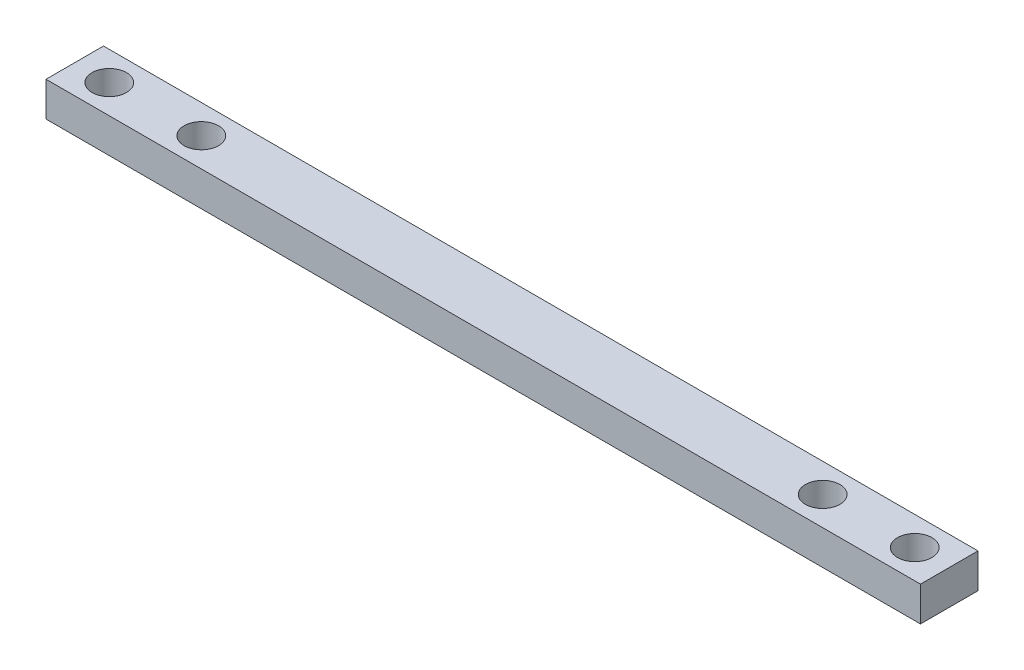
ISO-10303-21;
HEADER;
FILE_DESCRIPTION(('STEP AP214'),'2;1');
FILE_NAME('part.step','',(''),(''),'','','');
FILE_SCHEMA(('AUTOMOTIVE_DESIGN { 1 0 10303 214 1 1 1 1 }'));
ENDSEC;
DATA;
#1=APPLICATION_CONTEXT('core data for automotive mechanical design processes');
#2=APPLICATION_PROTOCOL_DEFINITION('international standard','automotive_design',2000,#1);
#3=PRODUCT_CONTEXT('',#1,'mechanical');
#4=PRODUCT('Part','Part','',(#3));
#5=PRODUCT_RELATED_PRODUCT_CATEGORY('part','',(#4));
#6=PRODUCT_DEFINITION_FORMATION('','',#4);
#7=PRODUCT_DEFINITION_CONTEXT('part definition',#1,'design');
#8=PRODUCT_DEFINITION('design','',#6,#7);
#9=PRODUCT_DEFINITION_SHAPE('','',#8);
#10=(LENGTH_UNIT() NAMED_UNIT(*) SI_UNIT(.MILLI.,.METRE.));
#11=(NAMED_UNIT(*) PLANE_ANGLE_UNIT() SI_UNIT($,.RADIAN.));
#12=(NAMED_UNIT(*) SI_UNIT($,.STERADIAN.) SOLID_ANGLE_UNIT());
#13=UNCERTAINTY_MEASURE_WITH_UNIT(LENGTH_MEASURE(1.E-05),#10,'distance_accuracy_value','');
#14=(GEOMETRIC_REPRESENTATION_CONTEXT(3) GLOBAL_UNCERTAINTY_ASSIGNED_CONTEXT((#13)) GLOBAL_UNIT_ASSIGNED_CONTEXT((#10,
#11,#12)) REPRESENTATION_CONTEXT('',''));
#15=CARTESIAN_POINT('',(0.,0.,0.));
#16=DIRECTION('',(0.,0.,1.));
#17=DIRECTION('',(1.,0.,0.));
#18=AXIS2_PLACEMENT_3D('',#15,#16,#17);
#19=CARTESIAN_POINT('',(0.,3.,0.));
#20=DIRECTION('',(0.,-1.,0.));
#21=DIRECTION('',(0.,0.,-1.));
#22=AXIS2_PLACEMENT_3D('',#19,#20,#21);
#23=PLANE('',#22);
#24=DIRECTION('',(0.,0.,-1.));
#25=VECTOR('',#24,1.);
#26=CARTESIAN_POINT('',(38.,3.,2.49999999999999));
#27=LINE('',#26,#25);
#28=CARTESIAN_POINT('',(38.,3.,2.49999999999999));
#29=VERTEX_POINT('',#28);
#30=CARTESIAN_POINT('',(38.,3.,-2.49999999999999));
#31=VERTEX_POINT('',#30);
#32=EDGE_CURVE('E85',#29,#31,#27,.T.);
#33=ORIENTED_EDGE('',*,*,#32,.T.);
#34=DIRECTION('',(-1.,0.,0.));
#35=VECTOR('',#34,1.);
#36=CARTESIAN_POINT('',(-38.,3.,-2.49999999999998));
#37=LINE('',#36,#35);
#38=CARTESIAN_POINT('',(-38.,3.,-2.49999999999998));
#39=VERTEX_POINT('',#38);
#40=EDGE_CURVE('E80',#31,#39,#37,.T.);
#41=ORIENTED_EDGE('',*,*,#40,.T.);
#42=DIRECTION('',(0.,0.,1.));
#43=VECTOR('',#42,1.);
#44=CARTESIAN_POINT('',(-38.,3.,2.5));
#45=LINE('',#44,#43);
#46=CARTESIAN_POINT('',(-38.,3.,2.5));
#47=VERTEX_POINT('',#46);
#48=EDGE_CURVE('E83',#39,#47,#45,.T.);
#49=ORIENTED_EDGE('',*,*,#48,.T.);
#50=DIRECTION('',(1.,0.,0.));
#51=VECTOR('',#50,1.);
#52=CARTESIAN_POINT('',(-38.,3.,2.5));
#53=LINE('',#52,#51);
#54=EDGE_CURVE('E50',#47,#29,#53,.T.);
#55=ORIENTED_EDGE('',*,*,#54,.T.);
#56=EDGE_LOOP('',(#33,#41,#49,#55));
#57=FACE_BOUND('',#56,.T.);
#58=CARTESIAN_POINT('',(-35.,3.,0.));
#59=DIRECTION('',(0.,1.,0.));
#60=DIRECTION('',(0.,0.,1.));
#61=AXIS2_PLACEMENT_3D('',#58,#59,#60);
#62=CIRCLE('',#61,1.5);
#63=CARTESIAN_POINT('',(-35.,3.,1.5));
#64=VERTEX_POINT('',#63);
#65=EDGE_CURVE('E100',#64,#64,#62,.T.);
#66=ORIENTED_EDGE('',*,*,#65,.F.);
#67=EDGE_LOOP('',(#66));
#68=FACE_BOUND('',#67,.T.);
#69=CARTESIAN_POINT('',(-27.,3.,0.));
#70=DIRECTION('',(0.,1.,0.));
#71=DIRECTION('',(0.,0.,1.));
#72=AXIS2_PLACEMENT_3D('',#69,#70,#71);
#73=CIRCLE('',#72,1.5);
#74=CARTESIAN_POINT('',(-27.,3.,1.5));
#75=VERTEX_POINT('',#74);
#76=EDGE_CURVE('E115',#75,#75,#73,.T.);
#77=ORIENTED_EDGE('',*,*,#76,.F.);
#78=EDGE_LOOP('',(#77));
#79=FACE_BOUND('',#78,.T.);
#80=CARTESIAN_POINT('',(35.,3.,0.));
#81=DIRECTION('',(0.,1.,0.));
#82=DIRECTION('',(0.,0.,-1.));
#83=AXIS2_PLACEMENT_3D('',#80,#81,#82);
#84=CIRCLE('',#83,1.5);
#85=CARTESIAN_POINT('',(35.,3.,-1.5));
#86=VERTEX_POINT('',#85);
#87=EDGE_CURVE('E121',#86,#86,#84,.T.);
#88=ORIENTED_EDGE('',*,*,#87,.F.);
#89=EDGE_LOOP('',(#88));
#90=FACE_BOUND('',#89,.T.);
#91=CARTESIAN_POINT('',(27.,3.,0.));
#92=DIRECTION('',(0.,1.,0.));
#93=DIRECTION('',(0.,0.,-1.));
#94=AXIS2_PLACEMENT_3D('',#91,#92,#93);
#95=CIRCLE('',#94,1.5);
#96=CARTESIAN_POINT('',(27.,3.,-1.5));
#97=VERTEX_POINT('',#96);
#98=EDGE_CURVE('E127',#97,#97,#95,.T.);
#99=ORIENTED_EDGE('',*,*,#98,.F.);
#100=EDGE_LOOP('',(#99));
#101=FACE_BOUND('',#100,.T.);
#102=ADVANCED_FACE('F33',(#57,#68,#79,#90,#101),#23,.F.);
#103=CARTESIAN_POINT('',(0.,0.,0.));
#104=DIRECTION('',(0.,-1.,0.));
#105=DIRECTION('',(0.,0.,-1.));
#106=AXIS2_PLACEMENT_3D('',#103,#104,#105);
#107=PLANE('',#106);
#108=CARTESIAN_POINT('',(35.,0.,0.));
#109=DIRECTION('',(0.,1.,0.));
#110=DIRECTION('',(0.,0.,-1.));
#111=AXIS2_PLACEMENT_3D('',#108,#109,#110);
#112=CIRCLE('',#111,1.5);
#113=CARTESIAN_POINT('',(35.,0.,-1.5));
#114=VERTEX_POINT('',#113);
#115=EDGE_CURVE('E124',#114,#114,#112,.T.);
#116=ORIENTED_EDGE('',*,*,#115,.T.);
#117=EDGE_LOOP('',(#116));
#118=FACE_BOUND('',#117,.T.);
#119=CARTESIAN_POINT('',(-35.,0.,0.));
#120=DIRECTION('',(0.,1.,0.));
#121=DIRECTION('',(0.,0.,1.));
#122=AXIS2_PLACEMENT_3D('',#119,#120,#121);
#123=CIRCLE('',#122,1.5);
#124=CARTESIAN_POINT('',(-35.,0.,1.5));
#125=VERTEX_POINT('',#124);
#126=EDGE_CURVE('E112',#125,#125,#123,.T.);
#127=ORIENTED_EDGE('',*,*,#126,.T.);
#128=EDGE_LOOP('',(#127));
#129=FACE_BOUND('',#128,.T.);
#130=DIRECTION('',(0.,0.,-1.));
#131=VECTOR('',#130,1.);
#132=CARTESIAN_POINT('',(38.,0.,2.49999999999999));
#133=LINE('',#132,#131);
#134=CARTESIAN_POINT('',(38.,0.,2.49999999999999));
#135=VERTEX_POINT('',#134);
#136=CARTESIAN_POINT('',(38.,0.,-2.49999999999999));
#137=VERTEX_POINT('',#136);
#138=EDGE_CURVE('E97',#135,#137,#133,.T.);
#139=ORIENTED_EDGE('',*,*,#138,.F.);
#140=DIRECTION('',(1.,0.,0.));
#141=VECTOR('',#140,1.);
#142=CARTESIAN_POINT('',(-38.,0.,2.5));
#143=LINE('',#142,#141);
#144=CARTESIAN_POINT('',(-38.,0.,2.5));
#145=VERTEX_POINT('',#144);
#146=EDGE_CURVE('E73',#145,#135,#143,.T.);
#147=ORIENTED_EDGE('',*,*,#146,.F.);
#148=DIRECTION('',(0.,0.,1.));
#149=VECTOR('',#148,1.);
#150=CARTESIAN_POINT('',(-38.,0.,2.5));
#151=LINE('',#150,#149);
#152=CARTESIAN_POINT('',(-38.,0.,-2.49999999999998));
#153=VERTEX_POINT('',#152);
#154=EDGE_CURVE('E67',#153,#145,#151,.T.);
#155=ORIENTED_EDGE('',*,*,#154,.F.);
#156=DIRECTION('',(-1.,0.,0.));
#157=VECTOR('',#156,1.);
#158=CARTESIAN_POINT('',(-38.,0.,-2.49999999999998));
#159=LINE('',#158,#157);
#160=EDGE_CURVE('E89',#137,#153,#159,.T.);
#161=ORIENTED_EDGE('',*,*,#160,.F.);
#162=EDGE_LOOP('',(#139,#147,#155,#161));
#163=FACE_BOUND('',#162,.T.);
#164=CARTESIAN_POINT('',(-27.,0.,0.));
#165=DIRECTION('',(0.,1.,0.));
#166=DIRECTION('',(0.,0.,1.));
#167=AXIS2_PLACEMENT_3D('',#164,#165,#166);
#168=CIRCLE('',#167,1.5);
#169=CARTESIAN_POINT('',(-27.,0.,1.5));
#170=VERTEX_POINT('',#169);
#171=EDGE_CURVE('E118',#170,#170,#168,.T.);
#172=ORIENTED_EDGE('',*,*,#171,.T.);
#173=EDGE_LOOP('',(#172));
#174=FACE_BOUND('',#173,.T.);
#175=CARTESIAN_POINT('',(27.,0.,0.));
#176=DIRECTION('',(0.,1.,0.));
#177=DIRECTION('',(0.,0.,-1.));
#178=AXIS2_PLACEMENT_3D('',#175,#176,#177);
#179=CIRCLE('',#178,1.5);
#180=CARTESIAN_POINT('',(27.,0.,-1.5));
#181=VERTEX_POINT('',#180);
#182=EDGE_CURVE('E130',#181,#181,#179,.T.);
#183=ORIENTED_EDGE('',*,*,#182,.T.);
#184=EDGE_LOOP('',(#183));
#185=FACE_BOUND('',#184,.T.);
#186=ADVANCED_FACE('F108',(#118,#129,#163,#174,#185),#107,.T.);
#187=CARTESIAN_POINT('',(38.,3.,2.49999999999999));
#188=DIRECTION('',(-1.,0.,0.));
#189=DIRECTION('',(0.,0.,1.));
#190=AXIS2_PLACEMENT_3D('',#187,#188,#189);
#191=PLANE('',#190);
#192=ORIENTED_EDGE('',*,*,#138,.T.);
#193=DIRECTION('',(0.,-1.,0.));
#194=VECTOR('',#193,1.);
#195=CARTESIAN_POINT('',(38.,3.,-2.49999999999999));
#196=LINE('',#195,#194);
#197=EDGE_CURVE('E11',#31,#137,#196,.T.);
#198=ORIENTED_EDGE('',*,*,#197,.F.);
#199=ORIENTED_EDGE('',*,*,#32,.F.);
#200=DIRECTION('',(0.,-1.,0.));
#201=VECTOR('',#200,1.);
#202=CARTESIAN_POINT('',(38.,3.,2.49999999999999));
#203=LINE('',#202,#201);
#204=EDGE_CURVE('E93',#29,#135,#203,.T.);
#205=ORIENTED_EDGE('',*,*,#204,.T.);
#206=EDGE_LOOP('',(#192,#198,#199,#205));
#207=FACE_BOUND('',#206,.T.);
#208=ADVANCED_FACE('F35',(#207),#191,.F.);
#209=CARTESIAN_POINT('',(-38.,3.,-2.49999999999998));
#210=DIRECTION('',(0.,0.,1.));
#211=DIRECTION('',(1.,0.,0.));
#212=AXIS2_PLACEMENT_3D('',#209,#210,#211);
#213=PLANE('',#212);
#214=ORIENTED_EDGE('',*,*,#160,.T.);
#215=DIRECTION('',(0.,-1.,0.));
#216=VECTOR('',#215,1.);
#217=CARTESIAN_POINT('',(-38.,3.,-2.49999999999998));
#218=LINE('',#217,#216);
#219=EDGE_CURVE('E42',#39,#153,#218,.T.);
#220=ORIENTED_EDGE('',*,*,#219,.F.);
#221=ORIENTED_EDGE('',*,*,#40,.F.);
#222=ORIENTED_EDGE('',*,*,#197,.T.);
#223=EDGE_LOOP('',(#214,#220,#221,#222));
#224=FACE_BOUND('',#223,.T.);
#225=ADVANCED_FACE('F88',(#224),#213,.F.);
#226=CARTESIAN_POINT('',(-38.,3.,2.5));
#227=DIRECTION('',(1.,0.,0.));
#228=DIRECTION('',(0.,0.,-1.));
#229=AXIS2_PLACEMENT_3D('',#226,#227,#228);
#230=PLANE('',#229);
#231=ORIENTED_EDGE('',*,*,#154,.T.);
#232=DIRECTION('',(0.,-1.,0.));
#233=VECTOR('',#232,1.);
#234=CARTESIAN_POINT('',(-38.,3.,2.5));
#235=LINE('',#234,#233);
#236=EDGE_CURVE('E90',#47,#145,#235,.T.);
#237=ORIENTED_EDGE('',*,*,#236,.F.);
#238=ORIENTED_EDGE('',*,*,#48,.F.);
#239=ORIENTED_EDGE('',*,*,#219,.T.);
#240=EDGE_LOOP('',(#231,#237,#238,#239));
#241=FACE_BOUND('',#240,.T.);
#242=ADVANCED_FACE('F91',(#241),#230,.F.);
#243=CARTESIAN_POINT('',(-38.,3.,2.5));
#244=DIRECTION('',(0.,0.,-1.));
#245=DIRECTION('',(-1.,0.,0.));
#246=AXIS2_PLACEMENT_3D('',#243,#244,#245);
#247=PLANE('',#246);
#248=ORIENTED_EDGE('',*,*,#146,.T.);
#249=ORIENTED_EDGE('',*,*,#204,.F.);
#250=ORIENTED_EDGE('',*,*,#54,.F.);
#251=ORIENTED_EDGE('',*,*,#236,.T.);
#252=EDGE_LOOP('',(#248,#249,#250,#251));
#253=FACE_BOUND('',#252,.T.);
#254=ADVANCED_FACE('F105',(#253),#247,.F.);
#255=CARTESIAN_POINT('',(-35.,3.,0.));
#256=DIRECTION('',(0.,-1.,0.));
#257=DIRECTION('',(0.,0.,-1.));
#258=AXIS2_PLACEMENT_3D('',#255,#256,#257);
#259=CYLINDRICAL_SURFACE('',#258,1.5);
#260=ORIENTED_EDGE('',*,*,#65,.T.);
#261=EDGE_LOOP('',(#260));
#262=FACE_BOUND('',#261,.T.);
#263=ORIENTED_EDGE('',*,*,#126,.F.);
#264=EDGE_LOOP('',(#263));
#265=FACE_BOUND('',#264,.T.);
#266=ADVANCED_FACE('F147',(#262,#265),#259,.F.);
#267=CARTESIAN_POINT('',(-27.,3.,0.));
#268=DIRECTION('',(0.,-1.,0.));
#269=DIRECTION('',(0.,0.,-1.));
#270=AXIS2_PLACEMENT_3D('',#267,#268,#269);
#271=CYLINDRICAL_SURFACE('',#270,1.5);
#272=ORIENTED_EDGE('',*,*,#76,.T.);
#273=EDGE_LOOP('',(#272));
#274=FACE_BOUND('',#273,.T.);
#275=ORIENTED_EDGE('',*,*,#171,.F.);
#276=EDGE_LOOP('',(#275));
#277=FACE_BOUND('',#276,.T.);
#278=ADVANCED_FACE('F193',(#274,#277),#271,.F.);
#279=CARTESIAN_POINT('',(35.,3.,0.));
#280=DIRECTION('',(0.,-1.,0.));
#281=DIRECTION('',(0.,0.,-1.));
#282=AXIS2_PLACEMENT_3D('',#279,#280,#281);
#283=CYLINDRICAL_SURFACE('',#282,1.5);
#284=ORIENTED_EDGE('',*,*,#87,.T.);
#285=EDGE_LOOP('',(#284));
#286=FACE_BOUND('',#285,.T.);
#287=ORIENTED_EDGE('',*,*,#115,.F.);
#288=EDGE_LOOP('',(#287));
#289=FACE_BOUND('',#288,.T.);
#290=ADVANCED_FACE('F201',(#286,#289),#283,.F.);
#291=CARTESIAN_POINT('',(27.,3.,0.));
#292=DIRECTION('',(0.,-1.,0.));
#293=DIRECTION('',(0.,0.,-1.));
#294=AXIS2_PLACEMENT_3D('',#291,#292,#293);
#295=CYLINDRICAL_SURFACE('',#294,1.5);
#296=ORIENTED_EDGE('',*,*,#98,.T.);
#297=EDGE_LOOP('',(#296));
#298=FACE_BOUND('',#297,.T.);
#299=ORIENTED_EDGE('',*,*,#182,.F.);
#300=EDGE_LOOP('',(#299));
#301=FACE_BOUND('',#300,.T.);
#302=ADVANCED_FACE('F136',(#298,#301),#295,.F.);
#303=CLOSED_SHELL('',(#102,#186,#208,#225,#242,#254,#266,#278,#290,#302));
#304=MANIFOLD_SOLID_BREP('B2',#303);
#305=ADVANCED_BREP_SHAPE_REPRESENTATION('',(#18,#304),#14);
#306=SHAPE_DEFINITION_REPRESENTATION(#9,#305);
ENDSEC;
END-ISO-10303-21;
